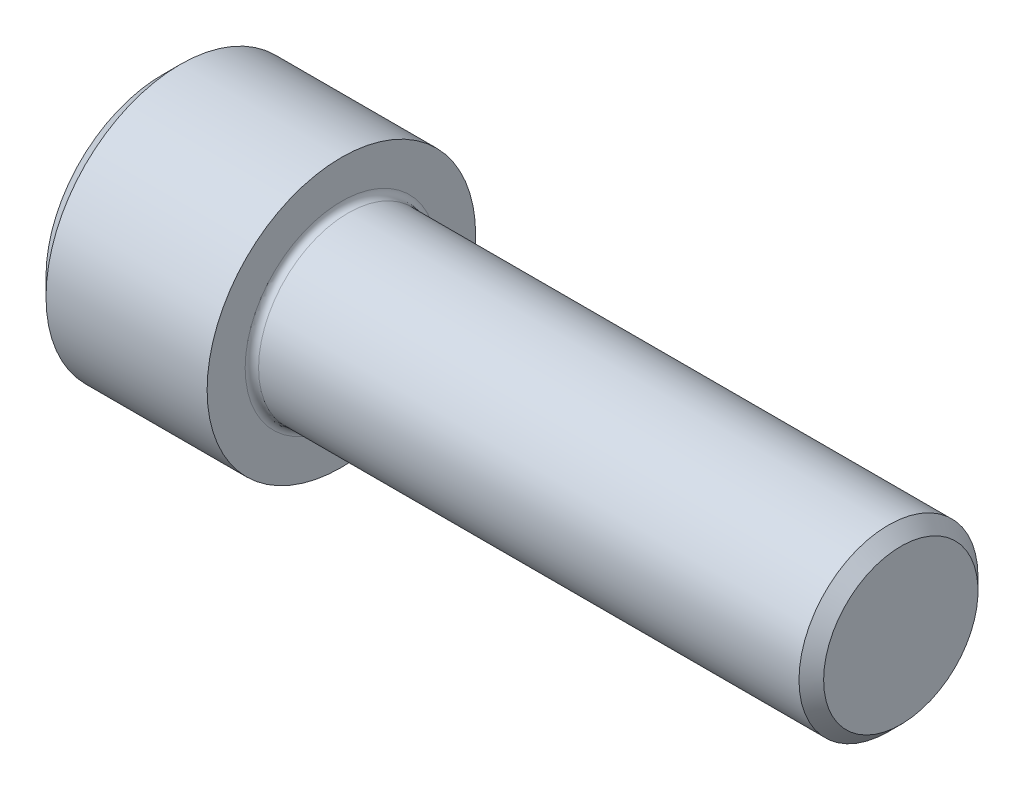
ISO-10303-21;
HEADER;
FILE_DESCRIPTION(('STEP AP214'),'2;1');
FILE_NAME('part.step','',(''),(''),'','','');
FILE_SCHEMA(('AUTOMOTIVE_DESIGN { 1 0 10303 214 1 1 1 1 }'));
ENDSEC;
DATA;
#1=APPLICATION_CONTEXT('core data for automotive mechanical design processes');
#2=APPLICATION_PROTOCOL_DEFINITION('international standard','automotive_design',2000,#1);
#3=PRODUCT_CONTEXT('',#1,'mechanical');
#4=PRODUCT('Part','Part','',(#3));
#5=PRODUCT_RELATED_PRODUCT_CATEGORY('part','',(#4));
#6=PRODUCT_DEFINITION_FORMATION('','',#4);
#7=PRODUCT_DEFINITION_CONTEXT('part definition',#1,'design');
#8=PRODUCT_DEFINITION('design','',#6,#7);
#9=PRODUCT_DEFINITION_SHAPE('','',#8);
#10=(LENGTH_UNIT() NAMED_UNIT(*) SI_UNIT(.MILLI.,.METRE.));
#11=(NAMED_UNIT(*) PLANE_ANGLE_UNIT() SI_UNIT($,.RADIAN.));
#12=(NAMED_UNIT(*) SI_UNIT($,.STERADIAN.) SOLID_ANGLE_UNIT());
#13=UNCERTAINTY_MEASURE_WITH_UNIT(LENGTH_MEASURE(1.E-05),#10,'distance_accuracy_value','');
#14=(GEOMETRIC_REPRESENTATION_CONTEXT(3) GLOBAL_UNCERTAINTY_ASSIGNED_CONTEXT((#13)) GLOBAL_UNIT_ASSIGNED_CONTEXT((#10,
#11,#12)) REPRESENTATION_CONTEXT('',''));
#15=CARTESIAN_POINT('',(0.,0.,0.));
#16=DIRECTION('',(0.,0.,1.));
#17=DIRECTION('',(1.,0.,0.));
#18=AXIS2_PLACEMENT_3D('',#15,#16,#17);
#19=CARTESIAN_POINT('',(0.,0.,0.));
#20=DIRECTION('',(-1.,0.,0.));
#21=DIRECTION('',(0.,0.,1.));
#22=AXIS2_PLACEMENT_3D('',#19,#20,#21);
#23=PLANE('',#22);
#24=DIRECTION('',(0.,-0.499999999999999,0.866025403784439));
#25=VECTOR('',#24,1.);
#26=CARTESIAN_POINT('',(0.,8.16488750687969,0.));
#27=LINE('',#26,#25);
#28=CARTESIAN_POINT('',(0.,8.16488750687969,0.));
#29=VERTEX_POINT('',#28);
#30=CARTESIAN_POINT('',(0.,4.08244375343985,7.07099999999999));
#31=VERTEX_POINT('',#30);
#32=EDGE_CURVE('E387',#29,#31,#27,.T.);
#33=ORIENTED_EDGE('',*,*,#32,.T.);
#34=DIRECTION('',(0.,1.,0.));
#35=VECTOR('',#34,1.);
#36=CARTESIAN_POINT('',(0.,-4.08244375343984,7.071));
#37=LINE('',#36,#35);
#38=CARTESIAN_POINT('',(0.,-4.08244375343984,7.071));
#39=VERTEX_POINT('',#38);
#40=EDGE_CURVE('E131',#39,#31,#37,.T.);
#41=ORIENTED_EDGE('',*,*,#40,.F.);
#42=DIRECTION('',(0.,-0.500000000000001,-0.866025403784438));
#43=VECTOR('',#42,1.);
#44=CARTESIAN_POINT('',(0.,-4.08244375343984,7.071));
#45=LINE('',#44,#43);
#46=CARTESIAN_POINT('',(0.,-8.16488750687969,0.));
#47=VERTEX_POINT('',#46);
#48=EDGE_CURVE('E390',#39,#47,#45,.T.);
#49=ORIENTED_EDGE('',*,*,#48,.T.);
#50=DIRECTION('',(0.,0.499999999999999,-0.866025403784439));
#51=VECTOR('',#50,1.);
#52=CARTESIAN_POINT('',(0.,-8.16488750687969,0.));
#53=LINE('',#52,#51);
#54=CARTESIAN_POINT('',(0.,-4.08244375343986,-7.071));
#55=VERTEX_POINT('',#54);
#56=EDGE_CURVE('E393',#47,#55,#53,.T.);
#57=ORIENTED_EDGE('',*,*,#56,.T.);
#58=DIRECTION('',(0.,-1.,0.));
#59=VECTOR('',#58,1.);
#60=CARTESIAN_POINT('',(0.,4.08244375343983,-7.07100000000001));
#61=LINE('',#60,#59);
#62=CARTESIAN_POINT('',(0.,4.08244375343983,-7.07100000000001));
#63=VERTEX_POINT('',#62);
#64=EDGE_CURVE('E396',#63,#55,#61,.T.);
#65=ORIENTED_EDGE('',*,*,#64,.F.);
#66=DIRECTION('',(0.,-0.500000000000001,-0.866025403784438));
#67=VECTOR('',#66,1.);
#68=CARTESIAN_POINT('',(0.,8.16488750687969,0.));
#69=LINE('',#68,#67);
#70=EDGE_CURVE('E126',#29,#63,#69,.T.);
#71=ORIENTED_EDGE('',*,*,#70,.F.);
#72=EDGE_LOOP('',(#33,#41,#49,#57,#65,#71));
#73=FACE_BOUND('',#72,.T.);
#74=CARTESIAN_POINT('',(0.,0.,0.));
#75=DIRECTION('',(-1.,0.,0.));
#76=DIRECTION('',(0.,0.,1.));
#77=AXIS2_PLACEMENT_3D('',#74,#75,#76);
#78=CIRCLE('',#77,10.4);
#79=CARTESIAN_POINT('',(0.,0.,10.4));
#80=VERTEX_POINT('',#79);
#81=EDGE_CURVE('E142',#80,#80,#78,.T.);
#82=ORIENTED_EDGE('',*,*,#81,.T.);
#83=EDGE_LOOP('',(#82));
#84=FACE_BOUND('',#83,.T.);
#85=ADVANCED_FACE('F35',(#73,#84),#23,.T.);
#86=CARTESIAN_POINT('',(66.,6.8985,0.));
#87=DIRECTION('',(1.,0.,0.));
#88=DIRECTION('',(0.,0.,-1.));
#89=AXIS2_PLACEMENT_3D('',#86,#87,#88);
#90=PLANE('',#89);
#91=CARTESIAN_POINT('',(66.,0.,0.));
#92=DIRECTION('',(-1.,0.,0.));
#93=DIRECTION('',(0.,0.,1.));
#94=AXIS2_PLACEMENT_3D('',#91,#92,#93);
#95=CIRCLE('',#94,6.8985);
#96=CARTESIAN_POINT('',(66.,0.,6.8985));
#97=VERTEX_POINT('',#96);
#98=EDGE_CURVE('E155',#97,#97,#95,.T.);
#99=ORIENTED_EDGE('',*,*,#98,.F.);
#100=EDGE_LOOP('',(#99));
#101=FACE_BOUND('',#100,.T.);
#102=ADVANCED_FACE('F176',(#101),#90,.T.);
#103=CARTESIAN_POINT('',(66.,0.,0.));
#104=DIRECTION('',(-1.,0.,0.));
#105=DIRECTION('',(0.,0.,1.));
#106=AXIS2_PLACEMENT_3D('',#103,#104,#105);
#107=CONICAL_SURFACE('',#106,6.8985,0.785398163397351);
#108=CARTESIAN_POINT('',(64.8984999999999,0.,0.));
#109=DIRECTION('',(-1.,0.,0.));
#110=DIRECTION('',(0.,0.,1.));
#111=AXIS2_PLACEMENT_3D('',#108,#109,#110);
#112=CIRCLE('',#111,7.99999999999988);
#113=CARTESIAN_POINT('',(64.8984999999999,0.,7.99999999999988));
#114=VERTEX_POINT('',#113);
#115=EDGE_CURVE('E152',#114,#114,#112,.T.);
#116=ORIENTED_EDGE('',*,*,#115,.F.);
#117=EDGE_LOOP('',(#116));
#118=FACE_BOUND('',#117,.T.);
#119=ORIENTED_EDGE('',*,*,#98,.T.);
#120=EDGE_LOOP('',(#119));
#121=FACE_BOUND('',#120,.T.);
#122=ADVANCED_FACE('F182',(#118,#121),#107,.T.);
#123=CARTESIAN_POINT('',(-31.75,0.,0.));
#124=DIRECTION('',(-1.,0.,0.));
#125=DIRECTION('',(0.,0.,1.));
#126=AXIS2_PLACEMENT_3D('',#123,#124,#125);
#127=CYLINDRICAL_SURFACE('',#126,7.99999999999994);
#128=CARTESIAN_POINT('',(16.6,0.,0.));
#129=DIRECTION('',(1.,0.,0.));
#130=DIRECTION('',(0.,0.,-1.));
#131=AXIS2_PLACEMENT_3D('',#128,#129,#130);
#132=CIRCLE('',#131,7.99999999999994);
#133=CARTESIAN_POINT('',(16.6,0.,-7.99999999999994));
#134=VERTEX_POINT('',#133);
#135=EDGE_CURVE('E11',#134,#134,#132,.T.);
#136=ORIENTED_EDGE('',*,*,#135,.T.);
#137=EDGE_LOOP('',(#136));
#138=FACE_BOUND('',#137,.T.);
#139=ORIENTED_EDGE('',*,*,#115,.T.);
#140=EDGE_LOOP('',(#139));
#141=FACE_BOUND('',#140,.T.);
#142=ADVANCED_FACE('F193',(#138,#141),#127,.T.);
#143=CARTESIAN_POINT('',(16.,12.,0.));
#144=DIRECTION('',(1.,0.,0.));
#145=DIRECTION('',(0.,0.,-1.));
#146=AXIS2_PLACEMENT_3D('',#143,#144,#145);
#147=PLANE('',#146);
#148=CARTESIAN_POINT('',(16.,0.,0.));
#149=DIRECTION('',(1.,0.,0.));
#150=DIRECTION('',(0.,0.,-1.));
#151=AXIS2_PLACEMENT_3D('',#148,#149,#150);
#152=CIRCLE('',#151,8.59999999999994);
#153=CARTESIAN_POINT('',(16.,0.,-8.59999999999994));
#154=VERTEX_POINT('',#153);
#155=EDGE_CURVE('E43',#154,#154,#152,.F.);
#156=ORIENTED_EDGE('',*,*,#155,.T.);
#157=EDGE_LOOP('',(#156));
#158=FACE_BOUND('',#157,.T.);
#159=CARTESIAN_POINT('',(16.,0.,0.));
#160=DIRECTION('',(-1.,0.,0.));
#161=DIRECTION('',(0.,0.,1.));
#162=AXIS2_PLACEMENT_3D('',#159,#160,#161);
#163=CIRCLE('',#162,12.);
#164=CARTESIAN_POINT('',(16.,0.,12.));
#165=VERTEX_POINT('',#164);
#166=EDGE_CURVE('E149',#165,#165,#163,.T.);
#167=ORIENTED_EDGE('',*,*,#166,.F.);
#168=EDGE_LOOP('',(#167));
#169=FACE_BOUND('',#168,.T.);
#170=ADVANCED_FACE('F160',(#158,#169),#147,.T.);
#171=CARTESIAN_POINT('',(-31.75,0.,0.));
#172=DIRECTION('',(-1.,0.,0.));
#173=DIRECTION('',(0.,0.,1.));
#174=AXIS2_PLACEMENT_3D('',#171,#172,#173);
#175=CYLINDRICAL_SURFACE('',#174,12.);
#176=ORIENTED_EDGE('',*,*,#166,.T.);
#177=EDGE_LOOP('',(#176));
#178=FACE_BOUND('',#177,.T.);
#179=CARTESIAN_POINT('',(1.6,0.,0.));
#180=DIRECTION('',(-1.,0.,0.));
#181=DIRECTION('',(0.,0.,1.));
#182=AXIS2_PLACEMENT_3D('',#179,#180,#181);
#183=CIRCLE('',#182,12.);
#184=CARTESIAN_POINT('',(1.6,0.,12.));
#185=VERTEX_POINT('',#184);
#186=EDGE_CURVE('E146',#185,#185,#183,.T.);
#187=ORIENTED_EDGE('',*,*,#186,.F.);
#188=EDGE_LOOP('',(#187));
#189=FACE_BOUND('',#188,.T.);
#190=ADVANCED_FACE('F171',(#178,#189),#175,.T.);
#191=CARTESIAN_POINT('',(0.,0.,0.));
#192=DIRECTION('',(1.,0.,0.));
#193=DIRECTION('',(0.,0.,-1.));
#194=AXIS2_PLACEMENT_3D('',#191,#192,#193);
#195=CONICAL_SURFACE('',#194,10.4,0.785398163397447);
#196=ORIENTED_EDGE('',*,*,#186,.T.);
#197=EDGE_LOOP('',(#196));
#198=FACE_BOUND('',#197,.T.);
#199=ORIENTED_EDGE('',*,*,#81,.F.);
#200=EDGE_LOOP('',(#199));
#201=FACE_BOUND('',#200,.T.);
#202=ADVANCED_FACE('F164',(#198,#201),#195,.T.);
#203=CARTESIAN_POINT('',(16.6,0.,0.));
#204=DIRECTION('',(1.,0.,0.));
#205=DIRECTION('',(0.,0.,-1.));
#206=AXIS2_PLACEMENT_3D('',#203,#204,#205);
#207=TOROIDAL_SURFACE('',#206,8.59999999999994,0.6);
#208=ORIENTED_EDGE('',*,*,#135,.F.);
#209=EDGE_LOOP('',(#208));
#210=FACE_BOUND('',#209,.T.);
#211=ORIENTED_EDGE('',*,*,#155,.F.);
#212=EDGE_LOOP('',(#211));
#213=FACE_BOUND('',#212,.T.);
#214=ADVANCED_FACE('F37',(#210,#213),#207,.F.);
#215=CARTESIAN_POINT('',(8.,8.16488750687969,0.));
#216=DIRECTION('',(0.,-0.866025403784439,-0.499999999999999));
#217=DIRECTION('',(0.,0.499999999999999,-0.866025403784439));
#218=AXIS2_PLACEMENT_3D('',#215,#216,#217);
#219=PLANE('',#218);
#220=ORIENTED_EDGE('',*,*,#32,.F.);
#221=DIRECTION('',(-1.,0.,0.));
#222=VECTOR('',#221,1.);
#223=CARTESIAN_POINT('',(8.,8.16488750687969,0.));
#224=LINE('',#223,#222);
#225=CARTESIAN_POINT('',(8.,8.16488750687969,0.));
#226=VERTEX_POINT('',#225);
#227=EDGE_CURVE('E377',#226,#29,#224,.T.);
#228=ORIENTED_EDGE('',*,*,#227,.F.);
#229=DIRECTION('',(0.,-0.499999999999999,0.866025403784439));
#230=VECTOR('',#229,1.);
#231=CARTESIAN_POINT('',(8.,8.16488750687969,0.));
#232=LINE('',#231,#230);
#233=CARTESIAN_POINT('',(8.,6.12366563015976,3.53549999999999));
#234=VERTEX_POINT('',#233);
#235=EDGE_CURVE('E118',#226,#234,#232,.T.);
#236=ORIENTED_EDGE('',*,*,#235,.T.);
#237=CARTESIAN_POINT('',(8.,4.08244375343985,7.07099999999999));
#238=VERTEX_POINT('',#237);
#239=EDGE_CURVE('E109',#234,#238,#232,.T.);
#240=ORIENTED_EDGE('',*,*,#239,.T.);
#241=DIRECTION('',(-1.,0.,0.));
#242=VECTOR('',#241,1.);
#243=CARTESIAN_POINT('',(8.,4.08244375343985,7.07099999999999));
#244=LINE('',#243,#242);
#245=EDGE_CURVE('E123',#238,#31,#244,.T.);
#246=ORIENTED_EDGE('',*,*,#245,.T.);
#247=EDGE_LOOP('',(#220,#228,#236,#240,#246));
#248=FACE_BOUND('',#247,.T.);
#249=ADVANCED_FACE('F122',(#248),#219,.T.);
#250=CARTESIAN_POINT('',(8.,-4.08244375343984,7.071));
#251=DIRECTION('',(0.,0.,1.));
#252=DIRECTION('',(0.,-1.,0.));
#253=AXIS2_PLACEMENT_3D('',#250,#251,#252);
#254=PLANE('',#253);
#255=ORIENTED_EDGE('',*,*,#40,.T.);
#256=ORIENTED_EDGE('',*,*,#245,.F.);
#257=DIRECTION('',(0.,1.,0.));
#258=VECTOR('',#257,1.);
#259=CARTESIAN_POINT('',(8.,-4.08244375343984,7.071));
#260=LINE('',#259,#258);
#261=CARTESIAN_POINT('',(8.,0.,7.071));
#262=VERTEX_POINT('',#261);
#263=EDGE_CURVE('E106',#262,#238,#260,.T.);
#264=ORIENTED_EDGE('',*,*,#263,.F.);
#265=CARTESIAN_POINT('',(8.,-4.08244375343984,7.071));
#266=VERTEX_POINT('',#265);
#267=EDGE_CURVE('E117',#266,#262,#260,.T.);
#268=ORIENTED_EDGE('',*,*,#267,.F.);
#269=DIRECTION('',(-1.,0.,0.));
#270=VECTOR('',#269,1.);
#271=CARTESIAN_POINT('',(8.,-4.08244375343984,7.071));
#272=LINE('',#271,#270);
#273=EDGE_CURVE('E133',#266,#39,#272,.T.);
#274=ORIENTED_EDGE('',*,*,#273,.T.);
#275=EDGE_LOOP('',(#255,#256,#264,#268,#274));
#276=FACE_BOUND('',#275,.T.);
#277=ADVANCED_FACE('F128',(#276),#254,.F.);
#278=CARTESIAN_POINT('',(8.,-4.08244375343984,7.071));
#279=DIRECTION('',(0.,0.866025403784438,-0.500000000000001));
#280=DIRECTION('',(0.,0.500000000000001,0.866025403784438));
#281=AXIS2_PLACEMENT_3D('',#278,#279,#280);
#282=PLANE('',#281);
#283=ORIENTED_EDGE('',*,*,#48,.F.);
#284=ORIENTED_EDGE('',*,*,#273,.F.);
#285=DIRECTION('',(0.,-0.500000000000001,-0.866025403784438));
#286=VECTOR('',#285,1.);
#287=CARTESIAN_POINT('',(8.,-4.08244375343984,7.071));
#288=LINE('',#287,#286);
#289=CARTESIAN_POINT('',(8.,-6.12366563015976,3.53550000000001));
#290=VERTEX_POINT('',#289);
#291=EDGE_CURVE('E416',#266,#290,#288,.T.);
#292=ORIENTED_EDGE('',*,*,#291,.T.);
#293=CARTESIAN_POINT('',(8.,-8.16488750687969,0.));
#294=VERTEX_POINT('',#293);
#295=EDGE_CURVE('E405',#290,#294,#288,.T.);
#296=ORIENTED_EDGE('',*,*,#295,.T.);
#297=DIRECTION('',(-1.,0.,0.));
#298=VECTOR('',#297,1.);
#299=CARTESIAN_POINT('',(8.,-8.16488750687969,0.));
#300=LINE('',#299,#298);
#301=EDGE_CURVE('E138',#294,#47,#300,.T.);
#302=ORIENTED_EDGE('',*,*,#301,.T.);
#303=EDGE_LOOP('',(#283,#284,#292,#296,#302));
#304=FACE_BOUND('',#303,.T.);
#305=ADVANCED_FACE('F268',(#304),#282,.T.);
#306=CARTESIAN_POINT('',(8.,-8.16488750687969,0.));
#307=DIRECTION('',(0.,0.866025403784439,0.499999999999999));
#308=DIRECTION('',(0.,-0.499999999999999,0.866025403784439));
#309=AXIS2_PLACEMENT_3D('',#306,#307,#308);
#310=PLANE('',#309);
#311=ORIENTED_EDGE('',*,*,#56,.F.);
#312=ORIENTED_EDGE('',*,*,#301,.F.);
#313=DIRECTION('',(0.,0.499999999999999,-0.866025403784439));
#314=VECTOR('',#313,1.);
#315=CARTESIAN_POINT('',(8.,-8.16488750687969,0.));
#316=LINE('',#315,#314);
#317=CARTESIAN_POINT('',(8.,-6.12366563015977,-3.53549999999999));
#318=VERTEX_POINT('',#317);
#319=EDGE_CURVE('E383',#294,#318,#316,.T.);
#320=ORIENTED_EDGE('',*,*,#319,.T.);
#321=CARTESIAN_POINT('',(8.,-4.08244375343986,-7.071));
#322=VERTEX_POINT('',#321);
#323=EDGE_CURVE('E415',#318,#322,#316,.T.);
#324=ORIENTED_EDGE('',*,*,#323,.T.);
#325=DIRECTION('',(-1.,0.,0.));
#326=VECTOR('',#325,1.);
#327=CARTESIAN_POINT('',(8.,-4.08244375343986,-7.071));
#328=LINE('',#327,#326);
#329=EDGE_CURVE('E376',#322,#55,#328,.T.);
#330=ORIENTED_EDGE('',*,*,#329,.T.);
#331=EDGE_LOOP('',(#311,#312,#320,#324,#330));
#332=FACE_BOUND('',#331,.T.);
#333=ADVANCED_FACE('F276',(#332),#310,.T.);
#334=CARTESIAN_POINT('',(8.,4.08244375343983,-7.07100000000001));
#335=DIRECTION('',(0.,0.,-1.));
#336=DIRECTION('',(0.,1.,0.));
#337=AXIS2_PLACEMENT_3D('',#334,#335,#336);
#338=PLANE('',#337);
#339=ORIENTED_EDGE('',*,*,#64,.T.);
#340=ORIENTED_EDGE('',*,*,#329,.F.);
#341=DIRECTION('',(0.,-1.,0.));
#342=VECTOR('',#341,1.);
#343=CARTESIAN_POINT('',(8.,4.08244375343983,-7.07100000000001));
#344=LINE('',#343,#342);
#345=CARTESIAN_POINT('',(8.,0.,-7.071));
#346=VERTEX_POINT('',#345);
#347=EDGE_CURVE('E380',#346,#322,#344,.T.);
#348=ORIENTED_EDGE('',*,*,#347,.F.);
#349=CARTESIAN_POINT('',(8.,4.08244375343983,-7.07100000000001));
#350=VERTEX_POINT('',#349);
#351=EDGE_CURVE('E50',#350,#346,#344,.T.);
#352=ORIENTED_EDGE('',*,*,#351,.F.);
#353=DIRECTION('',(-1.,0.,0.));
#354=VECTOR('',#353,1.);
#355=CARTESIAN_POINT('',(8.,4.08244375343983,-7.07100000000001));
#356=LINE('',#355,#354);
#357=EDGE_CURVE('E373',#350,#63,#356,.T.);
#358=ORIENTED_EDGE('',*,*,#357,.T.);
#359=EDGE_LOOP('',(#339,#340,#348,#352,#358));
#360=FACE_BOUND('',#359,.T.);
#361=ADVANCED_FACE('F285',(#360),#338,.F.);
#362=CARTESIAN_POINT('',(8.,8.16488750687969,0.));
#363=DIRECTION('',(0.,0.866025403784438,-0.500000000000001));
#364=DIRECTION('',(0.,0.500000000000001,0.866025403784438));
#365=AXIS2_PLACEMENT_3D('',#362,#363,#364);
#366=PLANE('',#365);
#367=ORIENTED_EDGE('',*,*,#70,.T.);
#368=ORIENTED_EDGE('',*,*,#357,.F.);
#369=DIRECTION('',(0.,-0.500000000000001,-0.866025403784438));
#370=VECTOR('',#369,1.);
#371=CARTESIAN_POINT('',(8.,8.16488750687969,0.));
#372=LINE('',#371,#370);
#373=CARTESIAN_POINT('',(8.,6.12366563015976,-3.53550000000001));
#374=VERTEX_POINT('',#373);
#375=EDGE_CURVE('E363',#374,#350,#372,.T.);
#376=ORIENTED_EDGE('',*,*,#375,.F.);
#377=EDGE_CURVE('E369',#226,#374,#372,.T.);
#378=ORIENTED_EDGE('',*,*,#377,.F.);
#379=ORIENTED_EDGE('',*,*,#227,.T.);
#380=EDGE_LOOP('',(#367,#368,#376,#378,#379));
#381=FACE_BOUND('',#380,.T.);
#382=ADVANCED_FACE('F294',(#381),#366,.F.);
#383=CARTESIAN_POINT('',(8.,8.16488750687969,0.));
#384=DIRECTION('',(1.,0.,0.));
#385=DIRECTION('',(0.,0.,-1.));
#386=AXIS2_PLACEMENT_3D('',#383,#384,#385);
#387=PLANE('',#386);
#388=ORIENTED_EDGE('',*,*,#347,.T.);
#389=ORIENTED_EDGE('',*,*,#323,.F.);
#390=CARTESIAN_POINT('',(8.,0.,0.));
#391=DIRECTION('',(-1.,0.,0.));
#392=DIRECTION('',(0.,0.,1.));
#393=AXIS2_PLACEMENT_3D('',#390,#391,#392);
#394=CIRCLE('',#393,7.071);
#395=EDGE_CURVE('E411',#346,#318,#394,.T.);
#396=ORIENTED_EDGE('',*,*,#395,.F.);
#397=EDGE_LOOP('',(#388,#389,#396));
#398=FACE_BOUND('',#397,.T.);
#399=ADVANCED_FACE('F303',(#398),#387,.F.);
#400=ORIENTED_EDGE('',*,*,#319,.F.);
#401=ORIENTED_EDGE('',*,*,#295,.F.);
#402=EDGE_CURVE('E136',#318,#290,#394,.T.);
#403=ORIENTED_EDGE('',*,*,#402,.F.);
#404=EDGE_LOOP('',(#400,#401,#403));
#405=FACE_BOUND('',#404,.T.);
#406=ADVANCED_FACE('F312',(#405),#387,.F.);
#407=ORIENTED_EDGE('',*,*,#291,.F.);
#408=ORIENTED_EDGE('',*,*,#267,.T.);
#409=EDGE_CURVE('E132',#290,#262,#394,.T.);
#410=ORIENTED_EDGE('',*,*,#409,.F.);
#411=EDGE_LOOP('',(#407,#408,#410));
#412=FACE_BOUND('',#411,.T.);
#413=ADVANCED_FACE('F321',(#412),#387,.F.);
#414=ORIENTED_EDGE('',*,*,#263,.T.);
#415=ORIENTED_EDGE('',*,*,#239,.F.);
#416=EDGE_CURVE('E112',#262,#234,#394,.T.);
#417=ORIENTED_EDGE('',*,*,#416,.F.);
#418=EDGE_LOOP('',(#414,#415,#417));
#419=FACE_BOUND('',#418,.T.);
#420=ADVANCED_FACE('F108',(#419),#387,.F.);
#421=ORIENTED_EDGE('',*,*,#235,.F.);
#422=ORIENTED_EDGE('',*,*,#377,.T.);
#423=EDGE_CURVE('E143',#234,#374,#394,.T.);
#424=ORIENTED_EDGE('',*,*,#423,.F.);
#425=EDGE_LOOP('',(#421,#422,#424));
#426=FACE_BOUND('',#425,.T.);
#427=ADVANCED_FACE('F336',(#426),#387,.F.);
#428=ORIENTED_EDGE('',*,*,#375,.T.);
#429=ORIENTED_EDGE('',*,*,#351,.T.);
#430=EDGE_CURVE('E366',#374,#346,#394,.T.);
#431=ORIENTED_EDGE('',*,*,#430,.F.);
#432=EDGE_LOOP('',(#428,#429,#431));
#433=FACE_BOUND('',#432,.T.);
#434=ADVANCED_FACE('F251',(#433),#387,.F.);
#435=CARTESIAN_POINT('',(8.,0.,0.));
#436=DIRECTION('',(-1.,0.,0.));
#437=DIRECTION('',(0.,0.,1.));
#438=AXIS2_PLACEMENT_3D('',#435,#436,#437);
#439=CONICAL_SURFACE('',#438,7.071,1.04719755119659);
#440=CARTESIAN_POINT('',(12.0824437534399,0.,0.));
#441=VERTEX_POINT('',#440);
#442=VERTEX_LOOP('',#441);
#443=FACE_BOUND('',#442,.T.);
#444=ORIENTED_EDGE('',*,*,#416,.T.);
#445=ORIENTED_EDGE('',*,*,#423,.T.);
#446=ORIENTED_EDGE('',*,*,#430,.T.);
#447=ORIENTED_EDGE('',*,*,#395,.T.);
#448=ORIENTED_EDGE('',*,*,#402,.T.);
#449=ORIENTED_EDGE('',*,*,#409,.T.);
#450=EDGE_LOOP('',(#444,#445,#446,#447,#448,#449));
#451=FACE_BOUND('',#450,.T.);
#452=ADVANCED_FACE('F186',(#443,#451),#439,.F.);
#453=CLOSED_SHELL('',(#85,#102,#122,#142,#170,#190,#202,#214,#249,#277,#305,#333,#361,#382,#399,
#406,#413,#420,#427,#434,#452));
#454=MANIFOLD_SOLID_BREP('B2',#453);
#455=ADVANCED_BREP_SHAPE_REPRESENTATION('',(#18,#454),#14);
#456=SHAPE_DEFINITION_REPRESENTATION(#9,#455);
ENDSEC;
END-ISO-10303-21;
